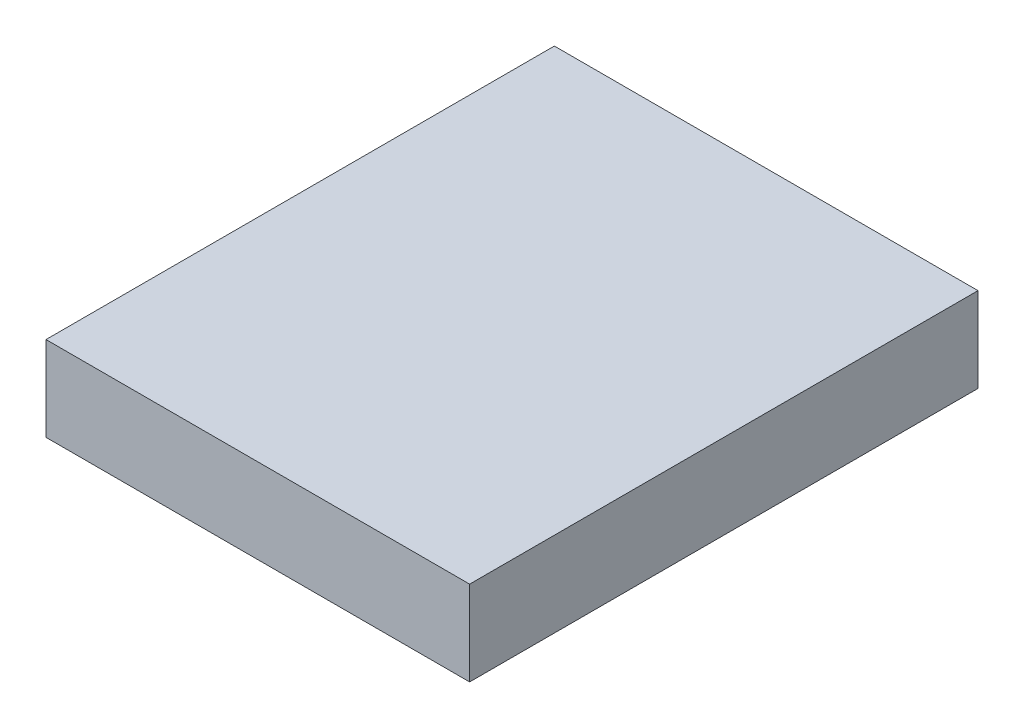
ISO-10303-21;
HEADER;
FILE_DESCRIPTION(('STEP AP214'),'2;1');
FILE_NAME('part.step','',(''),(''),'','','');
FILE_SCHEMA(('AUTOMOTIVE_DESIGN { 1 0 10303 214 1 1 1 1 }'));
ENDSEC;
DATA;
#1=APPLICATION_CONTEXT('core data for automotive mechanical design processes');
#2=APPLICATION_PROTOCOL_DEFINITION('international standard','automotive_design',2000,#1);
#3=PRODUCT_CONTEXT('',#1,'mechanical');
#4=PRODUCT('Part','Part','',(#3));
#5=PRODUCT_RELATED_PRODUCT_CATEGORY('part','',(#4));
#6=PRODUCT_DEFINITION_FORMATION('','',#4);
#7=PRODUCT_DEFINITION_CONTEXT('part definition',#1,'design');
#8=PRODUCT_DEFINITION('design','',#6,#7);
#9=PRODUCT_DEFINITION_SHAPE('','',#8);
#10=(LENGTH_UNIT() NAMED_UNIT(*) SI_UNIT(.MILLI.,.METRE.));
#11=(NAMED_UNIT(*) PLANE_ANGLE_UNIT() SI_UNIT($,.RADIAN.));
#12=(NAMED_UNIT(*) SI_UNIT($,.STERADIAN.) SOLID_ANGLE_UNIT());
#13=UNCERTAINTY_MEASURE_WITH_UNIT(LENGTH_MEASURE(1.E-05),#10,'distance_accuracy_value','');
#14=(GEOMETRIC_REPRESENTATION_CONTEXT(3) GLOBAL_UNCERTAINTY_ASSIGNED_CONTEXT((#13)) GLOBAL_UNIT_ASSIGNED_CONTEXT((#10,
#11,#12)) REPRESENTATION_CONTEXT('',''));
#15=CARTESIAN_POINT('',(0.,0.,0.));
#16=DIRECTION('',(0.,0.,1.));
#17=DIRECTION('',(1.,0.,0.));
#18=AXIS2_PLACEMENT_3D('',#15,#16,#17);
#19=CARTESIAN_POINT('',(50.,-10.,120.));
#20=DIRECTION('',(-1.,0.,0.));
#21=DIRECTION('',(0.,0.,1.));
#22=AXIS2_PLACEMENT_3D('',#19,#20,#21);
#23=PLANE('',#22);
#24=DIRECTION('',(0.,1.,0.));
#25=VECTOR('',#24,1.);
#26=CARTESIAN_POINT('',(50.,-10.,0.));
#27=LINE('',#26,#25);
#28=CARTESIAN_POINT('',(50.,-10.,0.));
#29=VERTEX_POINT('',#28);
#30=CARTESIAN_POINT('',(50.,10.,0.));
#31=VERTEX_POINT('',#30);
#32=EDGE_CURVE('E78',#29,#31,#27,.T.);
#33=ORIENTED_EDGE('',*,*,#32,.T.);
#34=DIRECTION('',(0.,0.,-1.));
#35=VECTOR('',#34,1.);
#36=CARTESIAN_POINT('',(50.,10.,120.));
#37=LINE('',#36,#35);
#38=CARTESIAN_POINT('',(50.,10.,120.));
#39=VERTEX_POINT('',#38);
#40=EDGE_CURVE('E11',#39,#31,#37,.T.);
#41=ORIENTED_EDGE('',*,*,#40,.F.);
#42=DIRECTION('',(0.,1.,0.));
#43=VECTOR('',#42,1.);
#44=CARTESIAN_POINT('',(50.,-10.,120.));
#45=LINE('',#44,#43);
#46=CARTESIAN_POINT('',(50.,-10.,120.));
#47=VERTEX_POINT('',#46);
#48=EDGE_CURVE('E70',#47,#39,#45,.T.);
#49=ORIENTED_EDGE('',*,*,#48,.F.);
#50=DIRECTION('',(0.,0.,-1.));
#51=VECTOR('',#50,1.);
#52=CARTESIAN_POINT('',(50.,-10.,120.));
#53=LINE('',#52,#51);
#54=EDGE_CURVE('E74',#47,#29,#53,.T.);
#55=ORIENTED_EDGE('',*,*,#54,.T.);
#56=EDGE_LOOP('',(#33,#41,#49,#55));
#57=FACE_BOUND('',#56,.T.);
#58=ADVANCED_FACE('F16',(#57),#23,.F.);
#59=CARTESIAN_POINT('',(-50.,10.,120.));
#60=DIRECTION('',(0.,-1.,0.));
#61=DIRECTION('',(0.,0.,-1.));
#62=AXIS2_PLACEMENT_3D('',#59,#60,#61);
#63=PLANE('',#62);
#64=DIRECTION('',(-1.,0.,0.));
#65=VECTOR('',#64,1.);
#66=CARTESIAN_POINT('',(-50.,10.,0.));
#67=LINE('',#66,#65);
#68=CARTESIAN_POINT('',(-50.,10.,0.));
#69=VERTEX_POINT('',#68);
#70=EDGE_CURVE('E75',#31,#69,#67,.T.);
#71=ORIENTED_EDGE('',*,*,#70,.T.);
#72=DIRECTION('',(0.,0.,-1.));
#73=VECTOR('',#72,1.);
#74=CARTESIAN_POINT('',(-50.,10.,120.));
#75=LINE('',#74,#73);
#76=CARTESIAN_POINT('',(-50.,10.,120.));
#77=VERTEX_POINT('',#76);
#78=EDGE_CURVE('E24',#77,#69,#75,.T.);
#79=ORIENTED_EDGE('',*,*,#78,.F.);
#80=DIRECTION('',(-1.,0.,0.));
#81=VECTOR('',#80,1.);
#82=CARTESIAN_POINT('',(-50.,10.,120.));
#83=LINE('',#82,#81);
#84=EDGE_CURVE('E62',#39,#77,#83,.T.);
#85=ORIENTED_EDGE('',*,*,#84,.F.);
#86=ORIENTED_EDGE('',*,*,#40,.T.);
#87=EDGE_LOOP('',(#71,#79,#85,#86));
#88=FACE_BOUND('',#87,.T.);
#89=ADVANCED_FACE('F69',(#88),#63,.F.);
#90=CARTESIAN_POINT('',(-50.,-10.,120.));
#91=DIRECTION('',(1.,0.,0.));
#92=DIRECTION('',(0.,0.,-1.));
#93=AXIS2_PLACEMENT_3D('',#90,#91,#92);
#94=PLANE('',#93);
#95=DIRECTION('',(0.,-1.,0.));
#96=VECTOR('',#95,1.);
#97=CARTESIAN_POINT('',(-50.,-10.,0.));
#98=LINE('',#97,#96);
#99=CARTESIAN_POINT('',(-50.,-10.,0.));
#100=VERTEX_POINT('',#99);
#101=EDGE_CURVE('E47',#69,#100,#98,.T.);
#102=ORIENTED_EDGE('',*,*,#101,.T.);
#103=DIRECTION('',(0.,0.,-1.));
#104=VECTOR('',#103,1.);
#105=CARTESIAN_POINT('',(-50.,-10.,120.));
#106=LINE('',#105,#104);
#107=CARTESIAN_POINT('',(-50.,-10.,120.));
#108=VERTEX_POINT('',#107);
#109=EDGE_CURVE('E71',#108,#100,#106,.T.);
#110=ORIENTED_EDGE('',*,*,#109,.F.);
#111=DIRECTION('',(0.,-1.,0.));
#112=VECTOR('',#111,1.);
#113=CARTESIAN_POINT('',(-50.,-10.,120.));
#114=LINE('',#113,#112);
#115=EDGE_CURVE('E65',#77,#108,#114,.T.);
#116=ORIENTED_EDGE('',*,*,#115,.F.);
#117=ORIENTED_EDGE('',*,*,#78,.T.);
#118=EDGE_LOOP('',(#102,#110,#116,#117));
#119=FACE_BOUND('',#118,.T.);
#120=ADVANCED_FACE('F73',(#119),#94,.F.);
#121=CARTESIAN_POINT('',(-50.,-10.,120.));
#122=DIRECTION('',(0.,1.,0.));
#123=DIRECTION('',(-1.,0.,0.));
#124=AXIS2_PLACEMENT_3D('',#121,#122,#123);
#125=PLANE('',#124);
#126=DIRECTION('',(1.,0.,0.));
#127=VECTOR('',#126,1.);
#128=CARTESIAN_POINT('',(-50.,-10.,0.));
#129=LINE('',#128,#127);
#130=EDGE_CURVE('E54',#100,#29,#129,.T.);
#131=ORIENTED_EDGE('',*,*,#130,.T.);
#132=ORIENTED_EDGE('',*,*,#54,.F.);
#133=DIRECTION('',(1.,0.,0.));
#134=VECTOR('',#133,1.);
#135=CARTESIAN_POINT('',(-50.,-10.,120.));
#136=LINE('',#135,#134);
#137=EDGE_CURVE('E32',#108,#47,#136,.T.);
#138=ORIENTED_EDGE('',*,*,#137,.F.);
#139=ORIENTED_EDGE('',*,*,#109,.T.);
#140=EDGE_LOOP('',(#131,#132,#138,#139));
#141=FACE_BOUND('',#140,.T.);
#142=ADVANCED_FACE('F88',(#141),#125,.F.);
#143=CARTESIAN_POINT('',(0.,0.,120.));
#144=DIRECTION('',(0.,0.,-1.));
#145=DIRECTION('',(-1.,0.,0.));
#146=AXIS2_PLACEMENT_3D('',#143,#144,#145);
#147=PLANE('',#146);
#148=ORIENTED_EDGE('',*,*,#48,.T.);
#149=ORIENTED_EDGE('',*,*,#84,.T.);
#150=ORIENTED_EDGE('',*,*,#115,.T.);
#151=ORIENTED_EDGE('',*,*,#137,.T.);
#152=EDGE_LOOP('',(#148,#149,#150,#151));
#153=FACE_BOUND('',#152,.T.);
#154=ADVANCED_FACE('F64',(#153),#147,.F.);
#155=CARTESIAN_POINT('',(0.,0.,0.));
#156=DIRECTION('',(0.,0.,-1.));
#157=DIRECTION('',(-1.,0.,0.));
#158=AXIS2_PLACEMENT_3D('',#155,#156,#157);
#159=PLANE('',#158);
#160=ORIENTED_EDGE('',*,*,#32,.F.);
#161=ORIENTED_EDGE('',*,*,#130,.F.);
#162=ORIENTED_EDGE('',*,*,#101,.F.);
#163=ORIENTED_EDGE('',*,*,#70,.F.);
#164=EDGE_LOOP('',(#160,#161,#162,#163));
#165=FACE_BOUND('',#164,.T.);
#166=ADVANCED_FACE('F90',(#165),#159,.T.);
#167=CLOSED_SHELL('',(#58,#89,#120,#142,#154,#166));
#168=MANIFOLD_SOLID_BREP('B1',#167);
#169=ADVANCED_BREP_SHAPE_REPRESENTATION('',(#18,#168),#14);
#170=SHAPE_DEFINITION_REPRESENTATION(#9,#169);
ENDSEC;
END-ISO-10303-21;
